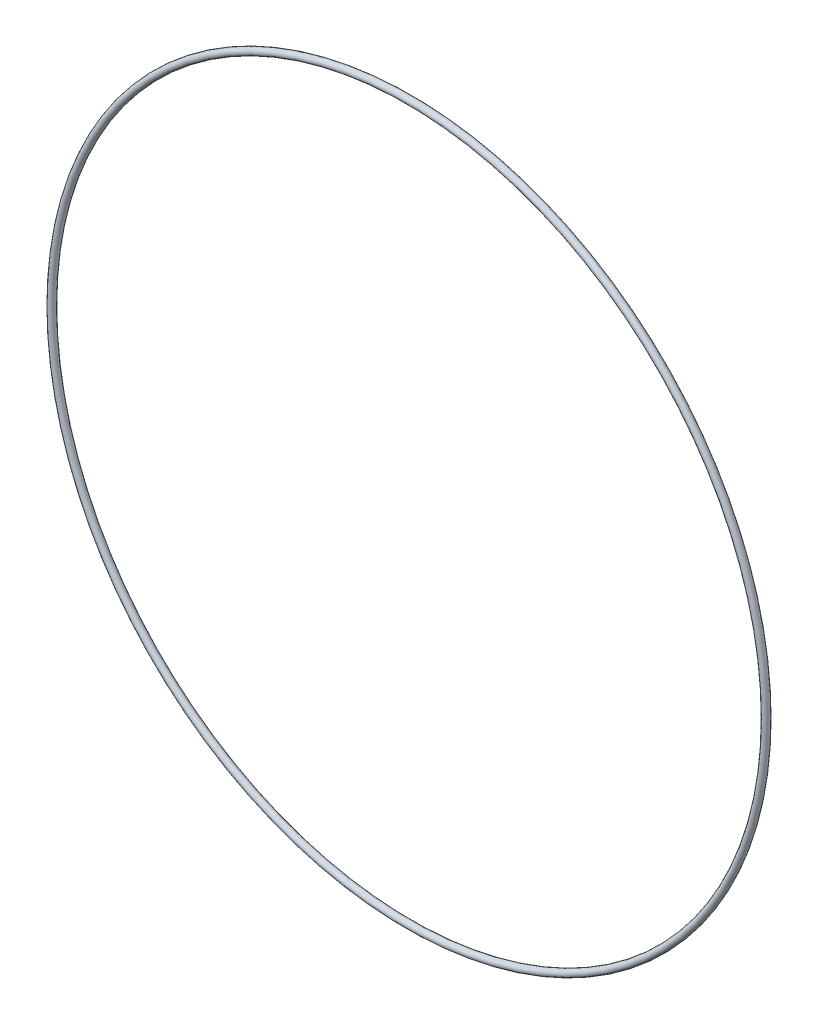
ISO-10303-21;
HEADER;
FILE_DESCRIPTION(('STEP AP214'),'2;1');
FILE_NAME('part.step','',(''),(''),'','','');
FILE_SCHEMA(('AUTOMOTIVE_DESIGN { 1 0 10303 214 1 1 1 1 }'));
ENDSEC;
DATA;
#1=APPLICATION_CONTEXT('core data for automotive mechanical design processes');
#2=APPLICATION_PROTOCOL_DEFINITION('international standard','automotive_design',2000,#1);
#3=PRODUCT_CONTEXT('',#1,'mechanical');
#4=PRODUCT('Part','Part','',(#3));
#5=PRODUCT_RELATED_PRODUCT_CATEGORY('part','',(#4));
#6=PRODUCT_DEFINITION_FORMATION('','',#4);
#7=PRODUCT_DEFINITION_CONTEXT('part definition',#1,'design');
#8=PRODUCT_DEFINITION('design','',#6,#7);
#9=PRODUCT_DEFINITION_SHAPE('','',#8);
#10=(LENGTH_UNIT() NAMED_UNIT(*) SI_UNIT(.MILLI.,.METRE.));
#11=(NAMED_UNIT(*) PLANE_ANGLE_UNIT() SI_UNIT($,.RADIAN.));
#12=(NAMED_UNIT(*) SI_UNIT($,.STERADIAN.) SOLID_ANGLE_UNIT());
#13=UNCERTAINTY_MEASURE_WITH_UNIT(LENGTH_MEASURE(1.E-05),#10,'distance_accuracy_value','');
#14=(GEOMETRIC_REPRESENTATION_CONTEXT(3) GLOBAL_UNCERTAINTY_ASSIGNED_CONTEXT((#13)) GLOBAL_UNIT_ASSIGNED_CONTEXT((#10,
#11,#12)) REPRESENTATION_CONTEXT('',''));
#15=CARTESIAN_POINT('',(0.,0.,0.));
#16=DIRECTION('',(0.,0.,1.));
#17=DIRECTION('',(1.,0.,0.));
#18=AXIS2_PLACEMENT_3D('',#15,#16,#17);
#19=CARTESIAN_POINT('',(0.,0.,0.));
#20=DIRECTION('',(0.,0.,-1.));
#21=DIRECTION('',(-1.,0.,0.));
#22=AXIS2_PLACEMENT_3D('',#19,#20,#21);
#23=TOROIDAL_SURFACE('',#22,154.,1.5);
#24=CARTESIAN_POINT('',(-155.5,0.,0.));
#25=VERTEX_POINT('',#24);
#26=VERTEX_LOOP('',#25);
#27=FACE_BOUND('',#26,.T.);
#28=ADVANCED_FACE('F40',(#27),#23,.T.);
#29=CLOSED_SHELL('',(#28));
#30=MANIFOLD_SOLID_BREP('B2',#29);
#31=ADVANCED_BREP_SHAPE_REPRESENTATION('',(#18,#30),#14);
#32=SHAPE_DEFINITION_REPRESENTATION(#9,#31);
ENDSEC;
END-ISO-10303-21;
